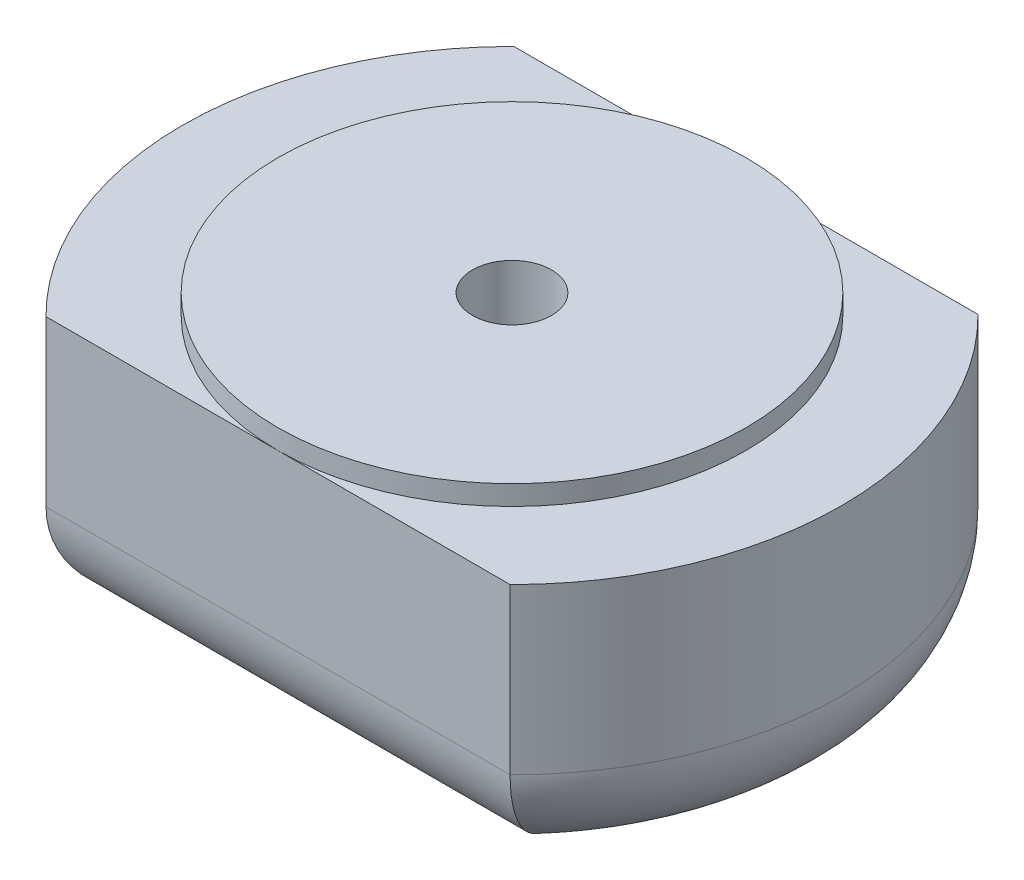
ISO-10303-21;
HEADER;
FILE_DESCRIPTION(('STEP AP214'),'2;1');
FILE_NAME('part.step','',(''),(''),'','','');
FILE_SCHEMA(('AUTOMOTIVE_DESIGN { 1 0 10303 214 1 1 1 1 }'));
ENDSEC;
DATA;
#1=APPLICATION_CONTEXT('core data for automotive mechanical design processes');
#2=APPLICATION_PROTOCOL_DEFINITION('international standard','automotive_design',2000,#1);
#3=PRODUCT_CONTEXT('',#1,'mechanical');
#4=PRODUCT('Part','Part','',(#3));
#5=PRODUCT_RELATED_PRODUCT_CATEGORY('part','',(#4));
#6=PRODUCT_DEFINITION_FORMATION('','',#4);
#7=PRODUCT_DEFINITION_CONTEXT('part definition',#1,'design');
#8=PRODUCT_DEFINITION('design','',#6,#7);
#9=PRODUCT_DEFINITION_SHAPE('','',#8);
#10=(LENGTH_UNIT() NAMED_UNIT(*) SI_UNIT(.MILLI.,.METRE.));
#11=(NAMED_UNIT(*) PLANE_ANGLE_UNIT() SI_UNIT($,.RADIAN.));
#12=(NAMED_UNIT(*) SI_UNIT($,.STERADIAN.) SOLID_ANGLE_UNIT());
#13=UNCERTAINTY_MEASURE_WITH_UNIT(LENGTH_MEASURE(1.E-05),#10,'distance_accuracy_value','');
#14=(GEOMETRIC_REPRESENTATION_CONTEXT(3) GLOBAL_UNCERTAINTY_ASSIGNED_CONTEXT((#13)) GLOBAL_UNIT_ASSIGNED_CONTEXT((#10,
#11,#12)) REPRESENTATION_CONTEXT('',''));
#15=CARTESIAN_POINT('',(0.,0.,0.));
#16=DIRECTION('',(0.,0.,1.));
#17=DIRECTION('',(1.,0.,0.));
#18=AXIS2_PLACEMENT_3D('',#15,#16,#17);
#19=CARTESIAN_POINT('',(0.,4.,0.));
#20=DIRECTION('',(0.,-1.,0.));
#21=DIRECTION('',(0.,0.,-1.));
#22=AXIS2_PLACEMENT_3D('',#19,#20,#21);
#23=CYLINDRICAL_SURFACE('',#22,5.);
#24=DIRECTION('',(0.,-1.,0.));
#25=VECTOR('',#24,1.);
#26=CARTESIAN_POINT('',(3.52100837829165,4.,3.55));
#27=LINE('',#26,#25);
#28=CARTESIAN_POINT('',(3.52100837829165,1.5,3.55));
#29=VERTEX_POINT('',#28);
#30=CARTESIAN_POINT('',(3.52100837829165,4.,3.55));
#31=VERTEX_POINT('',#30);
#32=EDGE_CURVE('E135',#29,#31,#27,.F.);
#33=ORIENTED_EDGE('',*,*,#32,.F.);
#34=CARTESIAN_POINT('',(0.,1.5,0.));
#35=DIRECTION('',(0.,1.,0.));
#36=DIRECTION('',(0.,0.,1.));
#37=AXIS2_PLACEMENT_3D('',#34,#35,#36);
#38=CIRCLE('',#37,5.);
#39=CARTESIAN_POINT('',(3.52100837829165,1.5,-3.55));
#40=VERTEX_POINT('',#39);
#41=EDGE_CURVE('E55',#29,#40,#38,.T.);
#42=ORIENTED_EDGE('',*,*,#41,.T.);
#43=DIRECTION('',(0.,-1.,0.));
#44=VECTOR('',#43,1.);
#45=CARTESIAN_POINT('',(3.52100837829165,4.,-3.55));
#46=LINE('',#45,#44);
#47=CARTESIAN_POINT('',(3.52100837829165,4.,-3.55));
#48=VERTEX_POINT('',#47);
#49=EDGE_CURVE('E142',#48,#40,#46,.T.);
#50=ORIENTED_EDGE('',*,*,#49,.F.);
#51=CARTESIAN_POINT('',(0.,4.,0.));
#52=DIRECTION('',(0.,1.,0.));
#53=DIRECTION('',(0.,0.,1.));
#54=AXIS2_PLACEMENT_3D('',#51,#52,#53);
#55=CIRCLE('',#54,5.);
#56=EDGE_CURVE('E119',#31,#48,#55,.T.);
#57=ORIENTED_EDGE('',*,*,#56,.F.);
#58=EDGE_LOOP('',(#33,#42,#50,#57));
#59=FACE_BOUND('',#58,.T.);
#60=ADVANCED_FACE('F40',(#59),#23,.T.);
#61=DIRECTION('',(0.,-1.,0.));
#62=VECTOR('',#61,1.);
#63=CARTESIAN_POINT('',(-3.52100837829165,4.,-3.55));
#64=LINE('',#63,#62);
#65=CARTESIAN_POINT('',(-3.52100837829165,1.5,-3.55));
#66=VERTEX_POINT('',#65);
#67=CARTESIAN_POINT('',(-3.52100837829165,4.,-3.55));
#68=VERTEX_POINT('',#67);
#69=EDGE_CURVE('E127',#66,#68,#64,.F.);
#70=ORIENTED_EDGE('',*,*,#69,.F.);
#71=CARTESIAN_POINT('',(0.,1.5,0.));
#72=DIRECTION('',(0.,1.,0.));
#73=DIRECTION('',(0.,0.,1.));
#74=AXIS2_PLACEMENT_3D('',#71,#72,#73);
#75=CIRCLE('',#74,5.);
#76=CARTESIAN_POINT('',(-3.52100837829165,1.5,3.55));
#77=VERTEX_POINT('',#76);
#78=EDGE_CURVE('E132',#66,#77,#75,.T.);
#79=ORIENTED_EDGE('',*,*,#78,.T.);
#80=DIRECTION('',(0.,-1.,0.));
#81=VECTOR('',#80,1.);
#82=CARTESIAN_POINT('',(-3.52100837829165,4.,3.55));
#83=LINE('',#82,#81);
#84=CARTESIAN_POINT('',(-3.52100837829165,4.,3.55));
#85=VERTEX_POINT('',#84);
#86=EDGE_CURVE('E123',#85,#77,#83,.T.);
#87=ORIENTED_EDGE('',*,*,#86,.F.);
#88=EDGE_CURVE('E108',#68,#85,#55,.T.);
#89=ORIENTED_EDGE('',*,*,#88,.F.);
#90=EDGE_LOOP('',(#70,#79,#87,#89));
#91=FACE_BOUND('',#90,.T.);
#92=ADVANCED_FACE('F130',(#91),#23,.T.);
#93=CARTESIAN_POINT('',(0.,4.,0.));
#94=DIRECTION('',(0.,1.,0.));
#95=DIRECTION('',(0.,0.,1.));
#96=AXIS2_PLACEMENT_3D('',#93,#94,#95);
#97=PLANE('',#96);
#98=ORIENTED_EDGE('',*,*,#88,.T.);
#99=DIRECTION('',(1.,0.,0.));
#100=VECTOR('',#99,1.);
#101=CARTESIAN_POINT('',(-5.,4.,3.55));
#102=LINE('',#101,#100);
#103=CARTESIAN_POINT('',(0.,4.,3.55));
#104=VERTEX_POINT('',#103);
#105=EDGE_CURVE('E112',#85,#104,#102,.T.);
#106=ORIENTED_EDGE('',*,*,#105,.T.);
#107=CARTESIAN_POINT('',(0.,4.,0.));
#108=DIRECTION('',(0.,1.,0.));
#109=DIRECTION('',(0.,0.,1.));
#110=AXIS2_PLACEMENT_3D('',#107,#108,#109);
#111=CIRCLE('',#110,3.55);
#112=CARTESIAN_POINT('',(0.,4.,-3.55));
#113=VERTEX_POINT('',#112);
#114=EDGE_CURVE('E155',#113,#104,#111,.T.);
#115=ORIENTED_EDGE('',*,*,#114,.F.);
#116=DIRECTION('',(-1.,0.,0.));
#117=VECTOR('',#116,1.);
#118=CARTESIAN_POINT('',(-5.,4.,-3.55));
#119=LINE('',#118,#117);
#120=EDGE_CURVE('E114',#113,#68,#119,.T.);
#121=ORIENTED_EDGE('',*,*,#120,.T.);
#122=EDGE_LOOP('',(#98,#106,#115,#121));
#123=FACE_BOUND('',#122,.T.);
#124=ADVANCED_FACE('F110',(#123),#97,.T.);
#125=EDGE_CURVE('E152',#104,#113,#111,.T.);
#126=ORIENTED_EDGE('',*,*,#125,.F.);
#127=EDGE_CURVE('E125',#104,#31,#102,.T.);
#128=ORIENTED_EDGE('',*,*,#127,.T.);
#129=ORIENTED_EDGE('',*,*,#56,.T.);
#130=EDGE_CURVE('E326',#48,#113,#119,.T.);
#131=ORIENTED_EDGE('',*,*,#130,.T.);
#132=EDGE_LOOP('',(#126,#128,#129,#131));
#133=FACE_BOUND('',#132,.T.);
#134=ADVANCED_FACE('F220',(#133),#97,.T.);
#135=CARTESIAN_POINT('',(0.,0.,0.));
#136=DIRECTION('',(0.,1.,0.));
#137=DIRECTION('',(0.,0.,1.));
#138=AXIS2_PLACEMENT_3D('',#135,#136,#137);
#139=PLANE('',#138);
#140=DIRECTION('',(1.,0.,0.));
#141=VECTOR('',#140,1.);
#142=CARTESIAN_POINT('',(-3.52100837829165,0.,2.05));
#143=LINE('',#142,#141);
#144=CARTESIAN_POINT('',(2.83681159050086,0.,2.05));
#145=VERTEX_POINT('',#144);
#146=CARTESIAN_POINT('',(-2.83681159050086,0.,2.05));
#147=VERTEX_POINT('',#146);
#148=EDGE_CURVE('E166',#145,#147,#143,.F.);
#149=ORIENTED_EDGE('',*,*,#148,.T.);
#150=CARTESIAN_POINT('',(0.,0.,0.));
#151=DIRECTION('',(0.,1.,0.));
#152=DIRECTION('',(0.,0.,1.));
#153=AXIS2_PLACEMENT_3D('',#150,#151,#152);
#154=CIRCLE('',#153,3.5);
#155=CARTESIAN_POINT('',(-2.83681159050086,0.,-2.05));
#156=VERTEX_POINT('',#155);
#157=EDGE_CURVE('E169',#147,#156,#154,.F.);
#158=ORIENTED_EDGE('',*,*,#157,.T.);
#159=DIRECTION('',(-1.,0.,0.));
#160=VECTOR('',#159,1.);
#161=CARTESIAN_POINT('',(3.52100837829165,0.,-2.05));
#162=LINE('',#161,#160);
#163=CARTESIAN_POINT('',(2.83681159050086,0.,-2.05));
#164=VERTEX_POINT('',#163);
#165=EDGE_CURVE('E160',#156,#164,#162,.F.);
#166=ORIENTED_EDGE('',*,*,#165,.T.);
#167=CARTESIAN_POINT('',(0.,0.,0.));
#168=DIRECTION('',(0.,1.,0.));
#169=DIRECTION('',(0.,0.,1.));
#170=AXIS2_PLACEMENT_3D('',#167,#168,#169);
#171=CIRCLE('',#170,3.5);
#172=EDGE_CURVE('E163',#164,#145,#171,.F.);
#173=ORIENTED_EDGE('',*,*,#172,.T.);
#174=EDGE_LOOP('',(#149,#158,#166,#173));
#175=FACE_BOUND('',#174,.T.);
#176=CARTESIAN_POINT('',(0.,0.,0.));
#177=DIRECTION('',(0.,1.,0.));
#178=DIRECTION('',(0.,0.,1.));
#179=AXIS2_PLACEMENT_3D('',#176,#177,#178);
#180=CIRCLE('',#179,0.6);
#181=CARTESIAN_POINT('',(0.,0.,0.6));
#182=VERTEX_POINT('',#181);
#183=EDGE_CURVE('E140',#182,#182,#180,.T.);
#184=ORIENTED_EDGE('',*,*,#183,.T.);
#185=EDGE_LOOP('',(#184));
#186=FACE_BOUND('',#185,.T.);
#187=ADVANCED_FACE('F216',(#175,#186),#139,.F.);
#188=CARTESIAN_POINT('',(0.,4.3,0.));
#189=DIRECTION('',(0.,-1.,0.));
#190=DIRECTION('',(0.,0.,-1.));
#191=AXIS2_PLACEMENT_3D('',#188,#189,#190);
#192=CYLINDRICAL_SURFACE('',#191,3.55);
#193=CARTESIAN_POINT('',(0.,4.3,0.));
#194=DIRECTION('',(0.,1.,0.));
#195=DIRECTION('',(0.,0.,1.));
#196=AXIS2_PLACEMENT_3D('',#193,#194,#195);
#197=CIRCLE('',#196,3.55);
#198=CARTESIAN_POINT('',(0.,4.3,3.55));
#199=VERTEX_POINT('',#198);
#200=EDGE_CURVE('E120',#199,#199,#197,.T.);
#201=ORIENTED_EDGE('',*,*,#200,.F.);
#202=EDGE_LOOP('',(#201));
#203=FACE_BOUND('',#202,.T.);
#204=ORIENTED_EDGE('',*,*,#125,.T.);
#205=ORIENTED_EDGE('',*,*,#114,.T.);
#206=EDGE_LOOP('',(#204,#205));
#207=FACE_BOUND('',#206,.T.);
#208=ADVANCED_FACE('F219',(#203,#207),#192,.T.);
#209=CARTESIAN_POINT('',(0.,4.3,0.));
#210=DIRECTION('',(0.,1.,0.));
#211=DIRECTION('',(0.,0.,1.));
#212=AXIS2_PLACEMENT_3D('',#209,#210,#211);
#213=PLANE('',#212);
#214=CARTESIAN_POINT('',(0.,4.3,0.));
#215=DIRECTION('',(0.,1.,0.));
#216=DIRECTION('',(0.,0.,1.));
#217=AXIS2_PLACEMENT_3D('',#214,#215,#216);
#218=CIRCLE('',#217,0.6);
#219=CARTESIAN_POINT('',(0.,4.3,0.6));
#220=VERTEX_POINT('',#219);
#221=EDGE_CURVE('E134',#220,#220,#218,.T.);
#222=ORIENTED_EDGE('',*,*,#221,.F.);
#223=EDGE_LOOP('',(#222));
#224=FACE_BOUND('',#223,.T.);
#225=ORIENTED_EDGE('',*,*,#200,.T.);
#226=EDGE_LOOP('',(#225));
#227=FACE_BOUND('',#226,.T.);
#228=ADVANCED_FACE('F226',(#224,#227),#213,.T.);
#229=CARTESIAN_POINT('',(0.,0.,0.));
#230=DIRECTION('',(0.,1.,0.));
#231=DIRECTION('',(0.,0.,1.));
#232=AXIS2_PLACEMENT_3D('',#229,#230,#231);
#233=CYLINDRICAL_SURFACE('',#232,0.6);
#234=ORIENTED_EDGE('',*,*,#183,.F.);
#235=EDGE_LOOP('',(#234));
#236=FACE_BOUND('',#235,.T.);
#237=ORIENTED_EDGE('',*,*,#221,.T.);
#238=EDGE_LOOP('',(#237));
#239=FACE_BOUND('',#238,.T.);
#240=ADVANCED_FACE('F230',(#236,#239),#233,.F.);
#241=CARTESIAN_POINT('',(-5.,0.,-3.55));
#242=DIRECTION('',(0.,0.,-1.));
#243=DIRECTION('',(-1.,0.,0.));
#244=AXIS2_PLACEMENT_3D('',#241,#242,#243);
#245=PLANE('',#244);
#246=ORIENTED_EDGE('',*,*,#49,.T.);
#247=DIRECTION('',(-1.,0.,0.));
#248=VECTOR('',#247,1.);
#249=CARTESIAN_POINT('',(-3.52100837829165,1.5,-3.55));
#250=LINE('',#249,#248);
#251=EDGE_CURVE('E12',#40,#66,#250,.T.);
#252=ORIENTED_EDGE('',*,*,#251,.T.);
#253=ORIENTED_EDGE('',*,*,#69,.T.);
#254=ORIENTED_EDGE('',*,*,#120,.F.);
#255=ORIENTED_EDGE('',*,*,#130,.F.);
#256=EDGE_LOOP('',(#246,#252,#253,#254,#255));
#257=FACE_BOUND('',#256,.T.);
#258=ADVANCED_FACE('F234',(#257),#245,.T.);
#259=CARTESIAN_POINT('',(-5.,0.,3.55));
#260=DIRECTION('',(0.,0.,1.));
#261=DIRECTION('',(1.,0.,0.));
#262=AXIS2_PLACEMENT_3D('',#259,#260,#261);
#263=PLANE('',#262);
#264=ORIENTED_EDGE('',*,*,#86,.T.);
#265=DIRECTION('',(1.,0.,0.));
#266=VECTOR('',#265,1.);
#267=CARTESIAN_POINT('',(3.52100837829165,1.5,3.55));
#268=LINE('',#267,#266);
#269=EDGE_CURVE('E70',#77,#29,#268,.T.);
#270=ORIENTED_EDGE('',*,*,#269,.T.);
#271=ORIENTED_EDGE('',*,*,#32,.T.);
#272=ORIENTED_EDGE('',*,*,#127,.F.);
#273=ORIENTED_EDGE('',*,*,#105,.F.);
#274=EDGE_LOOP('',(#264,#270,#271,#272,#273));
#275=FACE_BOUND('',#274,.T.);
#276=ADVANCED_FACE('F122',(#275),#263,.T.);
#277=CARTESIAN_POINT('',(0.,1.5,0.));
#278=DIRECTION('',(0.,1.,0.));
#279=DIRECTION('',(0.,0.,1.));
#280=AXIS2_PLACEMENT_3D('',#277,#278,#279);
#281=TOROIDAL_SURFACE('',#280,3.5,1.5);
#282=CARTESIAN_POINT('',(3.52100837829165,1.5,3.55));
#283=CARTESIAN_POINT('',(3.52100829946792,1.46019910300025,3.55000123472176));
#284=CARTESIAN_POINT('',(3.5203556196595,1.42041802760544,3.54841475929038));
#285=CARTESIAN_POINT('',(3.51775215812503,1.34115640167505,3.54209577354441));
#286=CARTESIAN_POINT('',(3.51580160979964,1.30167579839537,3.53736382889171));
#287=CARTESIAN_POINT('',(3.50803117923525,1.18432204728488,3.51853593749066));
#288=CARTESIAN_POINT('',(3.50029238547195,1.10726181327544,3.49980747189543));
#289=CARTESIAN_POINT('',(3.47991080222381,0.95768794921596,3.45075055243537));
#290=CARTESIAN_POINT('',(3.46726879356661,0.885173597377626,3.42042394556318));
#291=CARTESIAN_POINT('',(3.43740941951839,0.746467462256599,3.34933143833261));
#292=CARTESIAN_POINT('',(3.42019070006174,0.680277558016773,3.30856244862088));
#293=CARTESIAN_POINT('',(3.38106420991846,0.554035593847869,3.21679412363665));
#294=CARTESIAN_POINT('',(3.35904076174617,0.494201728581598,3.16554481860142));
#295=CARTESIAN_POINT('',(3.3111064616507,0.383996310723642,3.05529379894893));
#296=CARTESIAN_POINT('',(3.28519457215253,0.333627291794746,2.99629001568356));
#297=CARTESIAN_POINT('',(3.22807059199271,0.239961875815402,2.86795472177729));
#298=CARTESIAN_POINT('',(3.19661403444135,0.197410943521641,2.79818887005732));
#299=CARTESIAN_POINT('',(3.13048830431603,0.124566450846414,2.65391871720066));
#300=CARTESIAN_POINT('',(3.09581738336435,0.0942796098736496,2.5794118442888));
#301=CARTESIAN_POINT('',(3.02530441332202,0.0470724657873881,2.43061061076582));
#302=CARTESIAN_POINT('',(2.98955779264883,0.0296854728637493,2.35641699637586));
#303=CARTESIAN_POINT('',(2.91630452105303,0.00636068460365982,2.20723984073609));
#304=CARTESIAN_POINT('',(2.8788013697044,0.000401039666216019,2.13225808316276));
#305=CARTESIAN_POINT('',(2.83942141750457,6.50651725854044E-06,2.05510767420129));
#306=CARTESIAN_POINT('',(2.83811683311949,-1.5275979447845E-08,2.05255359375752));
#307=CARTESIAN_POINT('',(2.83681159050086,0.,2.05));
#308=B_SPLINE_CURVE_WITH_KNOTS('',3,(#282,#283,#284,#285,#286,#287,#288,#289,#290,#291,#292,
#293,#294,#295,#296,#297,#298,#299,#300,#301,#302,#303,#304,#305,#306,#307),.UNSPECIFIED.,.F.,
.F.,(4,2,2,2,2,2,2,2,2,2,2,2,4),(0.,0.119326750379288,0.238632047570757,0.476428076852795,
0.71418625310821,0.952014850946991,1.19636786588974,1.44078619926366,1.7023755910117,
1.96410811243833,2.21583572972603,2.4670815506985,2.47568545440921),.UNSPECIFIED.);
#309=EDGE_CURVE('E343',#145,#29,#308,.F.);
#310=ORIENTED_EDGE('',*,*,#309,.F.);
#311=ORIENTED_EDGE('',*,*,#172,.F.);
#312=CARTESIAN_POINT('',(3.52100837829165,1.5,-3.55));
#313=CARTESIAN_POINT('',(3.52100829946792,1.46019910300025,-3.55000123472176));
#314=CARTESIAN_POINT('',(3.5203556196595,1.42041802760544,-3.54841475929038));
#315=CARTESIAN_POINT('',(3.51775215812503,1.34115640167505,-3.54209577354441));
#316=CARTESIAN_POINT('',(3.51580160979964,1.30167579839537,-3.53736382889171));
#317=CARTESIAN_POINT('',(3.50803117923525,1.18432204728488,-3.51853593749066));
#318=CARTESIAN_POINT('',(3.50029238547195,1.10726181327544,-3.49980747189543));
#319=CARTESIAN_POINT('',(3.47991080222381,0.95768794921596,-3.45075055243537));
#320=CARTESIAN_POINT('',(3.46726879356661,0.885173597377626,-3.42042394556318));
#321=CARTESIAN_POINT('',(3.43740941951839,0.746467462256599,-3.34933143833261));
#322=CARTESIAN_POINT('',(3.42019070006174,0.680277558016773,-3.30856244862088));
#323=CARTESIAN_POINT('',(3.38106420991846,0.554035593847869,-3.21679412363665));
#324=CARTESIAN_POINT('',(3.35904076174617,0.494201728581598,-3.16554481860142));
#325=CARTESIAN_POINT('',(3.3111064616507,0.383996310723642,-3.05529379894893));
#326=CARTESIAN_POINT('',(3.28519457215253,0.333627291794746,-2.99629001568356));
#327=CARTESIAN_POINT('',(3.22807059199271,0.239961875815402,-2.86795472177729));
#328=CARTESIAN_POINT('',(3.19661403444135,0.197410943521641,-2.79818887005732));
#329=CARTESIAN_POINT('',(3.13048830431603,0.124566450846414,-2.65391871720066));
#330=CARTESIAN_POINT('',(3.09581738336435,0.0942796098736496,-2.5794118442888));
#331=CARTESIAN_POINT('',(3.02530441332202,0.0470724657873881,-2.43061061076582));
#332=CARTESIAN_POINT('',(2.98955779264883,0.0296854728637493,-2.35641699637586));
#333=CARTESIAN_POINT('',(2.91630452105303,0.00636068460365982,-2.20723984073609));
#334=CARTESIAN_POINT('',(2.8788013697044,0.000401039666216019,-2.13225808316276));
#335=CARTESIAN_POINT('',(2.83942141750457,6.50651725854044E-06,-2.05510767420129));
#336=CARTESIAN_POINT('',(2.83811683311949,-1.5275979447845E-08,-2.05255359375752));
#337=CARTESIAN_POINT('',(2.83681159050086,0.,-2.05));
#338=B_SPLINE_CURVE_WITH_KNOTS('',3,(#312,#313,#314,#315,#316,#317,#318,#319,#320,#321,#322,
#323,#324,#325,#326,#327,#328,#329,#330,#331,#332,#333,#334,#335,#336,#337),.UNSPECIFIED.,.F.,
.F.,(4,2,2,2,2,2,2,2,2,2,2,2,4),(0.,0.119326750379288,0.238632047570757,0.476428076852795,
0.71418625310821,0.952014850946991,1.19636786588974,1.44078619926366,1.7023755910117,
1.96410811243833,2.21583572972603,2.4670815506985,2.47568545440921),.UNSPECIFIED.);
#339=EDGE_CURVE('E45',#40,#164,#338,.T.);
#340=ORIENTED_EDGE('',*,*,#339,.F.);
#341=ORIENTED_EDGE('',*,*,#41,.F.);
#342=EDGE_LOOP('',(#310,#311,#340,#341));
#343=FACE_BOUND('',#342,.T.);
#344=ADVANCED_FACE('F42',(#343),#281,.T.);
#345=CARTESIAN_POINT('',(-5.,1.5,-2.05));
#346=DIRECTION('',(1.,0.,0.));
#347=DIRECTION('',(0.,0.,-1.));
#348=AXIS2_PLACEMENT_3D('',#345,#346,#347);
#349=CYLINDRICAL_SURFACE('',#348,1.5);
#350=ORIENTED_EDGE('',*,*,#339,.T.);
#351=ORIENTED_EDGE('',*,*,#165,.F.);
#352=CARTESIAN_POINT('',(-3.52100837829165,1.5,-3.55));
#353=CARTESIAN_POINT('',(-3.52100829946792,1.46019910300025,-3.55000123472176));
#354=CARTESIAN_POINT('',(-3.5203556196595,1.42041802760544,-3.54841475929038));
#355=CARTESIAN_POINT('',(-3.51775215812503,1.34115640167505,-3.54209577354441));
#356=CARTESIAN_POINT('',(-3.51580160979964,1.30167579839537,-3.53736382889171));
#357=CARTESIAN_POINT('',(-3.50803117923525,1.18432204728488,-3.51853593749066));
#358=CARTESIAN_POINT('',(-3.50029238547195,1.10726181327544,-3.49980747189543));
#359=CARTESIAN_POINT('',(-3.47991080222381,0.95768794921596,-3.45075055243537));
#360=CARTESIAN_POINT('',(-3.46726879356661,0.885173597377626,-3.42042394556318));
#361=CARTESIAN_POINT('',(-3.43740941951839,0.746467462256599,-3.34933143833261));
#362=CARTESIAN_POINT('',(-3.42019070006174,0.680277558016773,-3.30856244862088));
#363=CARTESIAN_POINT('',(-3.38106420991846,0.554035593847869,-3.21679412363665));
#364=CARTESIAN_POINT('',(-3.35904076174617,0.494201728581598,-3.16554481860142));
#365=CARTESIAN_POINT('',(-3.3111064616507,0.383996310723642,-3.05529379894893));
#366=CARTESIAN_POINT('',(-3.28519457215253,0.333627291794746,-2.99629001568356));
#367=CARTESIAN_POINT('',(-3.22807059199271,0.239961875815402,-2.86795472177729));
#368=CARTESIAN_POINT('',(-3.19661403444135,0.197410943521641,-2.79818887005732));
#369=CARTESIAN_POINT('',(-3.13048830431603,0.124566450846414,-2.65391871720066));
#370=CARTESIAN_POINT('',(-3.09581738336435,0.0942796098736496,-2.5794118442888));
#371=CARTESIAN_POINT('',(-3.02530441332202,0.0470724657873881,-2.43061061076582));
#372=CARTESIAN_POINT('',(-2.98955779264883,0.0296854728637493,-2.35641699637586));
#373=CARTESIAN_POINT('',(-2.91630452105303,0.00636068460365982,-2.20723984073609));
#374=CARTESIAN_POINT('',(-2.8788013697044,0.000401039666216019,-2.13225808316276));
#375=CARTESIAN_POINT('',(-2.83942141750457,6.50651725854044E-06,-2.05510767420129));
#376=CARTESIAN_POINT('',(-2.83811683311949,-1.5275979447845E-08,-2.05255359375752));
#377=CARTESIAN_POINT('',(-2.83681159050086,0.,-2.05));
#378=B_SPLINE_CURVE_WITH_KNOTS('',3,(#352,#353,#354,#355,#356,#357,#358,#359,#360,#361,#362,
#363,#364,#365,#366,#367,#368,#369,#370,#371,#372,#373,#374,#375,#376,#377),.UNSPECIFIED.,.F.,
.F.,(4,2,2,2,2,2,2,2,2,2,2,2,4),(0.,0.119326750379288,0.238632047570757,0.476428076852795,
0.71418625310821,0.952014850946991,1.19636786588974,1.44078619926366,1.7023755910117,
1.96410811243833,2.21583572972603,2.4670815506985,2.47568545440921),.UNSPECIFIED.);
#379=EDGE_CURVE('E186',#66,#156,#378,.T.);
#380=ORIENTED_EDGE('',*,*,#379,.F.);
#381=ORIENTED_EDGE('',*,*,#251,.F.);
#382=EDGE_LOOP('',(#350,#351,#380,#381));
#383=FACE_BOUND('',#382,.T.);
#384=ADVANCED_FACE('F198',(#383),#349,.T.);
#385=CARTESIAN_POINT('',(-5.,1.5,2.05));
#386=DIRECTION('',(-1.,0.,0.));
#387=DIRECTION('',(0.,0.,1.));
#388=AXIS2_PLACEMENT_3D('',#385,#386,#387);
#389=CYLINDRICAL_SURFACE('',#388,1.5);
#390=ORIENTED_EDGE('',*,*,#309,.T.);
#391=ORIENTED_EDGE('',*,*,#269,.F.);
#392=CARTESIAN_POINT('',(-3.52100837829165,1.5,3.55));
#393=CARTESIAN_POINT('',(-3.52100829946792,1.46019910300025,3.55000123472176));
#394=CARTESIAN_POINT('',(-3.5203556196595,1.42041802760544,3.54841475929038));
#395=CARTESIAN_POINT('',(-3.51775215812503,1.34115640167505,3.54209577354441));
#396=CARTESIAN_POINT('',(-3.51580160979964,1.30167579839537,3.53736382889171));
#397=CARTESIAN_POINT('',(-3.50803117923525,1.18432204728488,3.51853593749066));
#398=CARTESIAN_POINT('',(-3.50029238547195,1.10726181327544,3.49980747189543));
#399=CARTESIAN_POINT('',(-3.47991080222381,0.95768794921596,3.45075055243537));
#400=CARTESIAN_POINT('',(-3.46726879356661,0.885173597377626,3.42042394556318));
#401=CARTESIAN_POINT('',(-3.43740941951839,0.746467462256599,3.34933143833261));
#402=CARTESIAN_POINT('',(-3.42019070006174,0.680277558016773,3.30856244862088));
#403=CARTESIAN_POINT('',(-3.38106420991846,0.554035593847869,3.21679412363665));
#404=CARTESIAN_POINT('',(-3.35904076174617,0.494201728581598,3.16554481860142));
#405=CARTESIAN_POINT('',(-3.3111064616507,0.383996310723642,3.05529379894893));
#406=CARTESIAN_POINT('',(-3.28519457215253,0.333627291794746,2.99629001568356));
#407=CARTESIAN_POINT('',(-3.22807059199271,0.239961875815402,2.86795472177729));
#408=CARTESIAN_POINT('',(-3.19661403444135,0.197410943521641,2.79818887005732));
#409=CARTESIAN_POINT('',(-3.13048830431603,0.124566450846414,2.65391871720066));
#410=CARTESIAN_POINT('',(-3.09581738336435,0.0942796098736496,2.5794118442888));
#411=CARTESIAN_POINT('',(-3.02530441332202,0.0470724657873881,2.43061061076582));
#412=CARTESIAN_POINT('',(-2.98955779264883,0.0296854728637493,2.35641699637586));
#413=CARTESIAN_POINT('',(-2.91630452105303,0.00636068460365982,2.20723984073609));
#414=CARTESIAN_POINT('',(-2.8788013697044,0.000401039666216019,2.13225808316276));
#415=CARTESIAN_POINT('',(-2.83942141750457,6.50651725854044E-06,2.05510767420129));
#416=CARTESIAN_POINT('',(-2.83811683311949,-1.5275979447845E-08,2.05255359375752));
#417=CARTESIAN_POINT('',(-2.83681159050086,0.,2.05));
#418=B_SPLINE_CURVE_WITH_KNOTS('',3,(#392,#393,#394,#395,#396,#397,#398,#399,#400,#401,#402,
#403,#404,#405,#406,#407,#408,#409,#410,#411,#412,#413,#414,#415,#416,#417),.UNSPECIFIED.,.F.,
.F.,(4,2,2,2,2,2,2,2,2,2,2,2,4),(0.,0.119326750379288,0.238632047570757,0.476428076852795,
0.71418625310821,0.952014850946991,1.19636786588974,1.44078619926366,1.7023755910117,
1.96410811243833,2.21583572972603,2.4670815506985,2.47568545440921),.UNSPECIFIED.);
#419=EDGE_CURVE('E177',#147,#77,#418,.F.);
#420=ORIENTED_EDGE('',*,*,#419,.F.);
#421=ORIENTED_EDGE('',*,*,#148,.F.);
#422=EDGE_LOOP('',(#390,#391,#420,#421));
#423=FACE_BOUND('',#422,.T.);
#424=ADVANCED_FACE('F191',(#423),#389,.T.);
#425=CARTESIAN_POINT('',(0.,1.5,0.));
#426=DIRECTION('',(0.,1.,0.));
#427=DIRECTION('',(0.,0.,1.));
#428=AXIS2_PLACEMENT_3D('',#425,#426,#427);
#429=TOROIDAL_SURFACE('',#428,3.5,1.5);
#430=ORIENTED_EDGE('',*,*,#379,.T.);
#431=ORIENTED_EDGE('',*,*,#157,.F.);
#432=ORIENTED_EDGE('',*,*,#419,.T.);
#433=ORIENTED_EDGE('',*,*,#78,.F.);
#434=EDGE_LOOP('',(#430,#431,#432,#433));
#435=FACE_BOUND('',#434,.T.);
#436=ADVANCED_FACE('F194',(#435),#429,.T.);
#437=CLOSED_SHELL('',(#60,#92,#124,#134,#187,#208,#228,#240,#258,#276,#344,#384,#424,#436));
#438=MANIFOLD_SOLID_BREP('B2',#437);
#439=ADVANCED_BREP_SHAPE_REPRESENTATION('',(#18,#438),#14);
#440=SHAPE_DEFINITION_REPRESENTATION(#9,#439);
ENDSEC;
END-ISO-10303-21;
